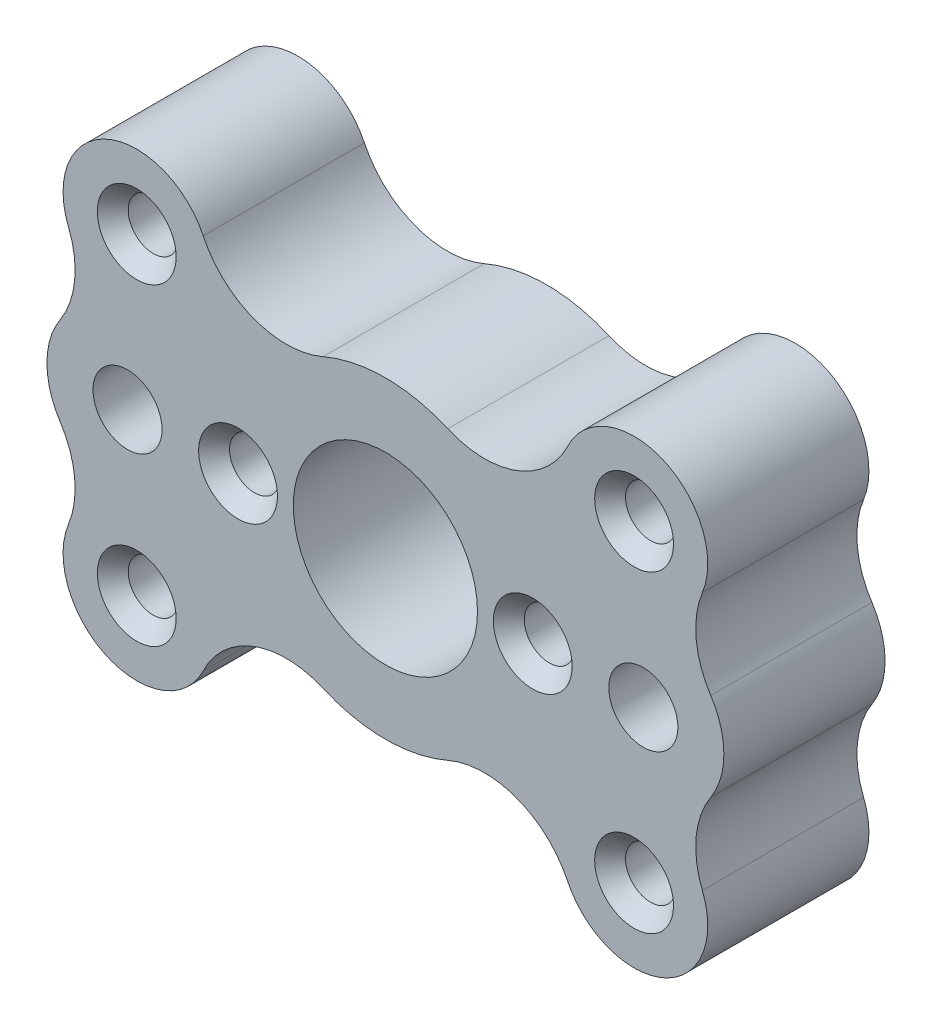
ISO-10303-21;
HEADER;
FILE_DESCRIPTION(('STEP AP214'),'2;1');
FILE_NAME('part.step','',(''),(''),'','','');
FILE_SCHEMA(('AUTOMOTIVE_DESIGN { 1 0 10303 214 1 1 1 1 }'));
ENDSEC;
DATA;
#1=APPLICATION_CONTEXT('core data for automotive mechanical design processes');
#2=APPLICATION_PROTOCOL_DEFINITION('international standard','automotive_design',2000,#1);
#3=PRODUCT_CONTEXT('',#1,'mechanical');
#4=PRODUCT('Part','Part','',(#3));
#5=PRODUCT_RELATED_PRODUCT_CATEGORY('part','',(#4));
#6=PRODUCT_DEFINITION_FORMATION('','',#4);
#7=PRODUCT_DEFINITION_CONTEXT('part definition',#1,'design');
#8=PRODUCT_DEFINITION('design','',#6,#7);
#9=PRODUCT_DEFINITION_SHAPE('','',#8);
#10=(LENGTH_UNIT() NAMED_UNIT(*) SI_UNIT(.MILLI.,.METRE.));
#11=(NAMED_UNIT(*) PLANE_ANGLE_UNIT() SI_UNIT($,.RADIAN.));
#12=(NAMED_UNIT(*) SI_UNIT($,.STERADIAN.) SOLID_ANGLE_UNIT());
#13=UNCERTAINTY_MEASURE_WITH_UNIT(LENGTH_MEASURE(1.E-05),#10,'distance_accuracy_value','');
#14=(GEOMETRIC_REPRESENTATION_CONTEXT(3) GLOBAL_UNCERTAINTY_ASSIGNED_CONTEXT((#13)) GLOBAL_UNIT_ASSIGNED_CONTEXT((#10,
#11,#12)) REPRESENTATION_CONTEXT('',''));
#15=CARTESIAN_POINT('',(0.,0.,0.));
#16=DIRECTION('',(0.,0.,1.));
#17=DIRECTION('',(1.,0.,0.));
#18=AXIS2_PLACEMENT_3D('',#15,#16,#17);
#19=CARTESIAN_POINT('',(0.,0.,11.1125));
#20=DIRECTION('',(0.,0.,1.));
#21=DIRECTION('',(1.,0.,0.));
#22=AXIS2_PLACEMENT_3D('',#19,#20,#21);
#23=PLANE('',#22);
#24=CARTESIAN_POINT('',(6.83271100749172,15.7246648704544,11.1125));
#25=DIRECTION('',(0.,0.,1.));
#26=DIRECTION('',(1.,0.,0.));
#27=AXIS2_PLACEMENT_3D('',#24,#25,#26);
#28=CIRCLE('',#27,6.35);
#29=CARTESIAN_POINT('',(4.3020773010133,9.90071491843423,11.1125));
#30=VERTEX_POINT('',#29);
#31=CARTESIAN_POINT('',(12.5617604477741,12.9859621646464,11.1125));
#32=VERTEX_POINT('',#31);
#33=EDGE_CURVE('E282',#30,#32,#28,.T.);
#34=ORIENTED_EDGE('',*,*,#33,.F.);
#35=CARTESIAN_POINT('',(0.,0.,11.1125));
#36=DIRECTION('',(0.,0.,1.));
#37=DIRECTION('',(1.,0.,0.));
#38=AXIS2_PLACEMENT_3D('',#35,#36,#37);
#39=CIRCLE('',#38,10.795);
#40=CARTESIAN_POINT('',(-4.30207730101329,9.90071491843423,11.1125));
#41=VERTEX_POINT('',#40);
#42=EDGE_CURVE('E109',#30,#41,#39,.T.);
#43=ORIENTED_EDGE('',*,*,#42,.T.);
#44=CARTESIAN_POINT('',(-6.83271100749169,15.7246648704544,11.1125));
#45=DIRECTION('',(0.,0.,-1.));
#46=DIRECTION('',(-1.,0.,0.));
#47=AXIS2_PLACEMENT_3D('',#44,#45,#46);
#48=CIRCLE('',#47,6.35);
#49=CARTESIAN_POINT('',(-12.5617604477741,12.9859621646464,11.1125));
#50=VERTEX_POINT('',#49);
#51=EDGE_CURVE('E208',#41,#50,#48,.T.);
#52=ORIENTED_EDGE('',*,*,#51,.T.);
#53=CARTESIAN_POINT('',(-17.145,10.795,11.1125));
#54=DIRECTION('',(0.,0.,1.));
#55=DIRECTION('',(1.,0.,0.));
#56=AXIS2_PLACEMENT_3D('',#53,#54,#55);
#57=CIRCLE('',#56,5.08);
#58=CARTESIAN_POINT('',(-21.8557818953723,8.89370203959706,11.1125));
#59=VERTEX_POINT('',#58);
#60=EDGE_CURVE('E188',#50,#59,#57,.T.);
#61=ORIENTED_EDGE('',*,*,#60,.T.);
#62=CARTESIAN_POINT('',(-27.7442592645877,6.51707958909339,11.1125));
#63=DIRECTION('',(0.,0.,-1.));
#64=DIRECTION('',(1.,0.,0.));
#65=AXIS2_PLACEMENT_3D('',#62,#63,#64);
#66=CIRCLE('',#65,6.35);
#67=CARTESIAN_POINT('',(-22.4299876568076,3.04130380824358,11.1125));
#68=VERTEX_POINT('',#67);
#69=EDGE_CURVE('E204',#59,#68,#66,.T.);
#70=ORIENTED_EDGE('',*,*,#69,.T.);
#71=CARTESIAN_POINT('',(-17.78,0.,11.1125));
#72=DIRECTION('',(0.,0.,1.));
#73=DIRECTION('',(1.,0.,0.));
#74=AXIS2_PLACEMENT_3D('',#71,#72,#73);
#75=CIRCLE('',#74,5.55625);
#76=CARTESIAN_POINT('',(-22.4299876568076,-3.04130380824359,11.1125));
#77=VERTEX_POINT('',#76);
#78=EDGE_CURVE('E132',#68,#77,#75,.T.);
#79=ORIENTED_EDGE('',*,*,#78,.T.);
#80=CARTESIAN_POINT('',(-27.7442592645877,-6.5170795890934,11.1125));
#81=DIRECTION('',(0.,0.,-1.));
#82=DIRECTION('',(1.,0.,0.));
#83=AXIS2_PLACEMENT_3D('',#80,#81,#82);
#84=CIRCLE('',#83,6.35);
#85=CARTESIAN_POINT('',(-21.8557818953723,-8.89370203959707,11.1125));
#86=VERTEX_POINT('',#85);
#87=EDGE_CURVE('E126',#77,#86,#84,.T.);
#88=ORIENTED_EDGE('',*,*,#87,.T.);
#89=CARTESIAN_POINT('',(-17.145,-10.795,11.1125));
#90=DIRECTION('',(0.,0.,1.));
#91=DIRECTION('',(1.,0.,0.));
#92=AXIS2_PLACEMENT_3D('',#89,#90,#91);
#93=CIRCLE('',#92,5.08);
#94=CARTESIAN_POINT('',(-12.5617604477741,-12.9859621646464,11.1125));
#95=VERTEX_POINT('',#94);
#96=EDGE_CURVE('E130',#86,#95,#93,.T.);
#97=ORIENTED_EDGE('',*,*,#96,.T.);
#98=CARTESIAN_POINT('',(-6.83271100749169,-15.7246648704544,11.1125));
#99=DIRECTION('',(0.,0.,-1.));
#100=DIRECTION('',(-1.,0.,0.));
#101=AXIS2_PLACEMENT_3D('',#98,#99,#100);
#102=CIRCLE('',#101,6.35);
#103=CARTESIAN_POINT('',(-4.30207730101329,-9.90071491843424,11.1125));
#104=VERTEX_POINT('',#103);
#105=EDGE_CURVE('E65',#95,#104,#102,.T.);
#106=ORIENTED_EDGE('',*,*,#105,.T.);
#107=CARTESIAN_POINT('',(0.,0.,11.1125));
#108=DIRECTION('',(0.,0.,1.));
#109=DIRECTION('',(-1.,0.,0.));
#110=AXIS2_PLACEMENT_3D('',#107,#108,#109);
#111=CIRCLE('',#110,10.795);
#112=CARTESIAN_POINT('',(4.30207730101327,-9.90071491843424,11.1125));
#113=VERTEX_POINT('',#112);
#114=EDGE_CURVE('E146',#104,#113,#111,.T.);
#115=ORIENTED_EDGE('',*,*,#114,.T.);
#116=CARTESIAN_POINT('',(6.83271100749166,-15.7246648704544,11.1125));
#117=DIRECTION('',(0.,0.,1.));
#118=DIRECTION('',(1.,0.,0.));
#119=AXIS2_PLACEMENT_3D('',#116,#117,#118);
#120=CIRCLE('',#119,6.35);
#121=CARTESIAN_POINT('',(12.5617604477741,-12.9859621646464,11.1125));
#122=VERTEX_POINT('',#121);
#123=EDGE_CURVE('E278',#122,#113,#120,.T.);
#124=ORIENTED_EDGE('',*,*,#123,.F.);
#125=CARTESIAN_POINT('',(17.145,-10.795,11.1125));
#126=DIRECTION('',(0.,0.,-1.));
#127=DIRECTION('',(-1.,0.,0.));
#128=AXIS2_PLACEMENT_3D('',#125,#126,#127);
#129=CIRCLE('',#128,5.08);
#130=CARTESIAN_POINT('',(21.8557818953723,-8.89370203959711,11.1125));
#131=VERTEX_POINT('',#130);
#132=EDGE_CURVE('E304',#131,#122,#129,.T.);
#133=ORIENTED_EDGE('',*,*,#132,.F.);
#134=CARTESIAN_POINT('',(27.7442592645877,-6.51707958909344,11.1125));
#135=DIRECTION('',(0.,0.,1.));
#136=DIRECTION('',(-1.,0.,0.));
#137=AXIS2_PLACEMENT_3D('',#134,#135,#136);
#138=CIRCLE('',#137,6.35);
#139=CARTESIAN_POINT('',(22.4299876568076,-3.04130380824362,11.1125));
#140=VERTEX_POINT('',#139);
#141=EDGE_CURVE('E307',#140,#131,#138,.T.);
#142=ORIENTED_EDGE('',*,*,#141,.F.);
#143=CARTESIAN_POINT('',(17.78,0.,11.1125));
#144=DIRECTION('',(0.,0.,-1.));
#145=DIRECTION('',(-1.,0.,0.));
#146=AXIS2_PLACEMENT_3D('',#143,#144,#145);
#147=CIRCLE('',#146,5.55625);
#148=CARTESIAN_POINT('',(22.4299876568076,3.04130380824355,11.1125));
#149=VERTEX_POINT('',#148);
#150=EDGE_CURVE('E310',#149,#140,#147,.T.);
#151=ORIENTED_EDGE('',*,*,#150,.F.);
#152=CARTESIAN_POINT('',(27.7442592645877,6.51707958909334,11.1125));
#153=DIRECTION('',(0.,0.,1.));
#154=DIRECTION('',(-1.,0.,0.));
#155=AXIS2_PLACEMENT_3D('',#152,#153,#154);
#156=CIRCLE('',#155,6.35);
#157=CARTESIAN_POINT('',(21.8557818953723,8.89370203959702,11.1125));
#158=VERTEX_POINT('',#157);
#159=EDGE_CURVE('E313',#158,#149,#156,.T.);
#160=ORIENTED_EDGE('',*,*,#159,.F.);
#161=CARTESIAN_POINT('',(17.145,10.795,11.1125));
#162=DIRECTION('',(0.,0.,-1.));
#163=DIRECTION('',(-1.,0.,0.));
#164=AXIS2_PLACEMENT_3D('',#161,#162,#163);
#165=CIRCLE('',#164,5.08);
#166=EDGE_CURVE('E316',#32,#158,#165,.T.);
#167=ORIENTED_EDGE('',*,*,#166,.F.);
#168=EDGE_LOOP('',(#34,#43,#52,#61,#70,#79,#88,#97,#106,#115,#124,#133,#142,#151,#160,#167));
#169=FACE_BOUND('',#168,.T.);
#170=CARTESIAN_POINT('',(-10.16,0.,11.1125));
#171=DIRECTION('',(0.,0.,1.));
#172=DIRECTION('',(1.,0.,0.));
#173=AXIS2_PLACEMENT_3D('',#170,#171,#172);
#174=CIRCLE('',#173,2.7178);
#175=CARTESIAN_POINT('',(-7.4422,0.,11.1125));
#176=VERTEX_POINT('',#175);
#177=EDGE_CURVE('E248',#176,#176,#174,.T.);
#178=ORIENTED_EDGE('',*,*,#177,.F.);
#179=EDGE_LOOP('',(#178));
#180=FACE_BOUND('',#179,.T.);
#181=CARTESIAN_POINT('',(-17.145,10.795,11.1125));
#182=DIRECTION('',(0.,0.,1.));
#183=DIRECTION('',(1.,0.,0.));
#184=AXIS2_PLACEMENT_3D('',#181,#182,#183);
#185=CIRCLE('',#184,2.7178);
#186=CARTESIAN_POINT('',(-14.4272,10.795,11.1125));
#187=VERTEX_POINT('',#186);
#188=EDGE_CURVE('E236',#187,#187,#185,.T.);
#189=ORIENTED_EDGE('',*,*,#188,.F.);
#190=EDGE_LOOP('',(#189));
#191=FACE_BOUND('',#190,.T.);
#192=CARTESIAN_POINT('',(-17.145,-10.795,11.1125));
#193=DIRECTION('',(0.,0.,1.));
#194=DIRECTION('',(1.,0.,0.));
#195=AXIS2_PLACEMENT_3D('',#192,#193,#194);
#196=CIRCLE('',#195,2.7178);
#197=CARTESIAN_POINT('',(-14.4272,-10.795,11.1125));
#198=VERTEX_POINT('',#197);
#199=EDGE_CURVE('E224',#198,#198,#196,.T.);
#200=ORIENTED_EDGE('',*,*,#199,.F.);
#201=EDGE_LOOP('',(#200));
#202=FACE_BOUND('',#201,.T.);
#203=CARTESIAN_POINT('',(0.,0.,11.1125));
#204=DIRECTION('',(0.,0.,-1.));
#205=DIRECTION('',(1.,0.,0.));
#206=AXIS2_PLACEMENT_3D('',#203,#204,#205);
#207=CIRCLE('',#206,6.35);
#208=CARTESIAN_POINT('',(6.35,0.,11.1125));
#209=VERTEX_POINT('',#208);
#210=EDGE_CURVE('E172',#209,#209,#207,.T.);
#211=ORIENTED_EDGE('',*,*,#210,.T.);
#212=EDGE_LOOP('',(#211));
#213=FACE_BOUND('',#212,.T.);
#214=CARTESIAN_POINT('',(-17.78,0.,11.1125));
#215=DIRECTION('',(0.,0.,1.));
#216=DIRECTION('',(1.,0.,0.));
#217=AXIS2_PLACEMENT_3D('',#214,#215,#216);
#218=CIRCLE('',#217,2.38125);
#219=CARTESIAN_POINT('',(-15.39875,0.,11.1125));
#220=VERTEX_POINT('',#219);
#221=EDGE_CURVE('E156',#220,#220,#218,.T.);
#222=ORIENTED_EDGE('',*,*,#221,.F.);
#223=EDGE_LOOP('',(#222));
#224=FACE_BOUND('',#223,.T.);
#225=CARTESIAN_POINT('',(10.16,0.,11.1125));
#226=DIRECTION('',(0.,0.,-1.));
#227=DIRECTION('',(-1.,0.,0.));
#228=AXIS2_PLACEMENT_3D('',#225,#226,#227);
#229=CIRCLE('',#228,2.7178);
#230=CARTESIAN_POINT('',(7.4422,0.,11.1125));
#231=VERTEX_POINT('',#230);
#232=EDGE_CURVE('E356',#231,#231,#229,.T.);
#233=ORIENTED_EDGE('',*,*,#232,.T.);
#234=EDGE_LOOP('',(#233));
#235=FACE_BOUND('',#234,.T.);
#236=CARTESIAN_POINT('',(17.145,10.795,11.1125));
#237=DIRECTION('',(0.,0.,-1.));
#238=DIRECTION('',(-1.,0.,0.));
#239=AXIS2_PLACEMENT_3D('',#236,#237,#238);
#240=CIRCLE('',#239,2.7178);
#241=CARTESIAN_POINT('',(14.4272,10.795,11.1125));
#242=VERTEX_POINT('',#241);
#243=EDGE_CURVE('E344',#242,#242,#240,.T.);
#244=ORIENTED_EDGE('',*,*,#243,.T.);
#245=EDGE_LOOP('',(#244));
#246=FACE_BOUND('',#245,.T.);
#247=CARTESIAN_POINT('',(17.145,-10.795,11.1125));
#248=DIRECTION('',(0.,0.,-1.));
#249=DIRECTION('',(-1.,0.,0.));
#250=AXIS2_PLACEMENT_3D('',#247,#248,#249);
#251=CIRCLE('',#250,2.7178);
#252=CARTESIAN_POINT('',(14.4272,-10.795,11.1125));
#253=VERTEX_POINT('',#252);
#254=EDGE_CURVE('E332',#253,#253,#251,.T.);
#255=ORIENTED_EDGE('',*,*,#254,.T.);
#256=EDGE_LOOP('',(#255));
#257=FACE_BOUND('',#256,.T.);
#258=CARTESIAN_POINT('',(17.78,0.,11.1125));
#259=DIRECTION('',(0.,0.,-1.));
#260=DIRECTION('',(-1.,0.,0.));
#261=AXIS2_PLACEMENT_3D('',#258,#259,#260);
#262=CIRCLE('',#261,2.38125);
#263=CARTESIAN_POINT('',(15.39875,0.,11.1125));
#264=VERTEX_POINT('',#263);
#265=EDGE_CURVE('E301',#264,#264,#262,.T.);
#266=ORIENTED_EDGE('',*,*,#265,.T.);
#267=EDGE_LOOP('',(#266));
#268=FACE_BOUND('',#267,.T.);
#269=ADVANCED_FACE('F48',(#169,#180,#191,#202,#213,#224,#235,#246,#257,#268),#23,.T.);
#270=CARTESIAN_POINT('',(0.,0.,0.));
#271=DIRECTION('',(0.,0.,1.));
#272=DIRECTION('',(1.,0.,0.));
#273=AXIS2_PLACEMENT_3D('',#270,#271,#272);
#274=PLANE('',#273);
#275=CARTESIAN_POINT('',(0.,0.,0.));
#276=DIRECTION('',(0.,0.,1.));
#277=DIRECTION('',(1.,0.,0.));
#278=AXIS2_PLACEMENT_3D('',#275,#276,#277);
#279=CIRCLE('',#278,10.795);
#280=CARTESIAN_POINT('',(4.3020773010133,9.90071491843423,0.));
#281=VERTEX_POINT('',#280);
#282=CARTESIAN_POINT('',(-4.30207730101329,9.90071491843423,0.));
#283=VERTEX_POINT('',#282);
#284=EDGE_CURVE('E155',#281,#283,#279,.T.);
#285=ORIENTED_EDGE('',*,*,#284,.F.);
#286=CARTESIAN_POINT('',(6.83271100749172,15.7246648704544,0.));
#287=DIRECTION('',(0.,0.,1.));
#288=DIRECTION('',(1.,0.,0.));
#289=AXIS2_PLACEMENT_3D('',#286,#287,#288);
#290=CIRCLE('',#289,6.35);
#291=CARTESIAN_POINT('',(12.5617604477741,12.9859621646464,0.));
#292=VERTEX_POINT('',#291);
#293=EDGE_CURVE('E298',#281,#292,#290,.T.);
#294=ORIENTED_EDGE('',*,*,#293,.T.);
#295=CARTESIAN_POINT('',(17.145,10.795,0.));
#296=DIRECTION('',(0.,0.,-1.));
#297=DIRECTION('',(-1.,0.,0.));
#298=AXIS2_PLACEMENT_3D('',#295,#296,#297);
#299=CIRCLE('',#298,5.08);
#300=CARTESIAN_POINT('',(21.8557818953723,8.89370203959702,0.));
#301=VERTEX_POINT('',#300);
#302=EDGE_CURVE('E295',#292,#301,#299,.T.);
#303=ORIENTED_EDGE('',*,*,#302,.T.);
#304=CARTESIAN_POINT('',(27.7442592645877,6.51707958909334,0.));
#305=DIRECTION('',(0.,0.,1.));
#306=DIRECTION('',(-1.,0.,0.));
#307=AXIS2_PLACEMENT_3D('',#304,#305,#306);
#308=CIRCLE('',#307,6.35);
#309=CARTESIAN_POINT('',(22.4299876568076,3.04130380824355,0.));
#310=VERTEX_POINT('',#309);
#311=EDGE_CURVE('E292',#301,#310,#308,.T.);
#312=ORIENTED_EDGE('',*,*,#311,.T.);
#313=CARTESIAN_POINT('',(17.78,0.,0.));
#314=DIRECTION('',(0.,0.,-1.));
#315=DIRECTION('',(-1.,0.,0.));
#316=AXIS2_PLACEMENT_3D('',#313,#314,#315);
#317=CIRCLE('',#316,5.55625);
#318=CARTESIAN_POINT('',(22.4299876568076,-3.04130380824362,0.));
#319=VERTEX_POINT('',#318);
#320=EDGE_CURVE('E289',#310,#319,#317,.T.);
#321=ORIENTED_EDGE('',*,*,#320,.T.);
#322=CARTESIAN_POINT('',(27.7442592645877,-6.51707958909344,0.));
#323=DIRECTION('',(0.,0.,1.));
#324=DIRECTION('',(-1.,0.,0.));
#325=AXIS2_PLACEMENT_3D('',#322,#323,#324);
#326=CIRCLE('',#325,6.35);
#327=CARTESIAN_POINT('',(21.8557818953723,-8.89370203959711,0.));
#328=VERTEX_POINT('',#327);
#329=EDGE_CURVE('E286',#319,#328,#326,.T.);
#330=ORIENTED_EDGE('',*,*,#329,.T.);
#331=CARTESIAN_POINT('',(17.145,-10.795,0.));
#332=DIRECTION('',(0.,0.,-1.));
#333=DIRECTION('',(-1.,0.,0.));
#334=AXIS2_PLACEMENT_3D('',#331,#332,#333);
#335=CIRCLE('',#334,5.08);
#336=CARTESIAN_POINT('',(12.5617604477741,-12.9859621646464,0.));
#337=VERTEX_POINT('',#336);
#338=EDGE_CURVE('E283',#328,#337,#335,.T.);
#339=ORIENTED_EDGE('',*,*,#338,.T.);
#340=CARTESIAN_POINT('',(6.83271100749166,-15.7246648704544,0.));
#341=DIRECTION('',(0.,0.,1.));
#342=DIRECTION('',(1.,0.,0.));
#343=AXIS2_PLACEMENT_3D('',#340,#341,#342);
#344=CIRCLE('',#343,6.35);
#345=CARTESIAN_POINT('',(4.30207730101327,-9.90071491843424,0.));
#346=VERTEX_POINT('',#345);
#347=EDGE_CURVE('E279',#337,#346,#344,.T.);
#348=ORIENTED_EDGE('',*,*,#347,.T.);
#349=CARTESIAN_POINT('',(0.,0.,0.));
#350=DIRECTION('',(0.,0.,1.));
#351=DIRECTION('',(-1.,0.,0.));
#352=AXIS2_PLACEMENT_3D('',#349,#350,#351);
#353=CIRCLE('',#352,10.795);
#354=CARTESIAN_POINT('',(-4.30207730101329,-9.90071491843424,0.));
#355=VERTEX_POINT('',#354);
#356=EDGE_CURVE('E169',#355,#346,#353,.T.);
#357=ORIENTED_EDGE('',*,*,#356,.F.);
#358=CARTESIAN_POINT('',(-6.83271100749169,-15.7246648704544,0.));
#359=DIRECTION('',(0.,0.,-1.));
#360=DIRECTION('',(-1.,0.,0.));
#361=AXIS2_PLACEMENT_3D('',#358,#359,#360);
#362=CIRCLE('',#361,6.35);
#363=CARTESIAN_POINT('',(-12.5617604477741,-12.9859621646464,0.));
#364=VERTEX_POINT('',#363);
#365=EDGE_CURVE('E101',#364,#355,#362,.T.);
#366=ORIENTED_EDGE('',*,*,#365,.F.);
#367=CARTESIAN_POINT('',(-17.145,-10.795,0.));
#368=DIRECTION('',(0.,0.,1.));
#369=DIRECTION('',(1.,0.,0.));
#370=AXIS2_PLACEMENT_3D('',#367,#368,#369);
#371=CIRCLE('',#370,5.08);
#372=CARTESIAN_POINT('',(-21.8557818953723,-8.89370203959707,0.));
#373=VERTEX_POINT('',#372);
#374=EDGE_CURVE('E95',#373,#364,#371,.T.);
#375=ORIENTED_EDGE('',*,*,#374,.F.);
#376=CARTESIAN_POINT('',(-27.7442592645877,-6.5170795890934,0.));
#377=DIRECTION('',(0.,0.,-1.));
#378=DIRECTION('',(1.,0.,0.));
#379=AXIS2_PLACEMENT_3D('',#376,#377,#378);
#380=CIRCLE('',#379,6.35);
#381=CARTESIAN_POINT('',(-22.4299876568076,-3.04130380824359,0.));
#382=VERTEX_POINT('',#381);
#383=EDGE_CURVE('E140',#382,#373,#380,.T.);
#384=ORIENTED_EDGE('',*,*,#383,.F.);
#385=CARTESIAN_POINT('',(-17.78,0.,0.));
#386=DIRECTION('',(0.,0.,1.));
#387=DIRECTION('',(1.,0.,0.));
#388=AXIS2_PLACEMENT_3D('',#385,#386,#387);
#389=CIRCLE('',#388,5.55625);
#390=CARTESIAN_POINT('',(-22.4299876568076,3.04130380824358,0.));
#391=VERTEX_POINT('',#390);
#392=EDGE_CURVE('E164',#391,#382,#389,.T.);
#393=ORIENTED_EDGE('',*,*,#392,.F.);
#394=CARTESIAN_POINT('',(-27.7442592645877,6.51707958909339,0.));
#395=DIRECTION('',(0.,0.,-1.));
#396=DIRECTION('',(1.,0.,0.));
#397=AXIS2_PLACEMENT_3D('',#394,#395,#396);
#398=CIRCLE('',#397,6.35);
#399=CARTESIAN_POINT('',(-21.8557818953723,8.89370203959706,0.));
#400=VERTEX_POINT('',#399);
#401=EDGE_CURVE('E162',#400,#391,#398,.T.);
#402=ORIENTED_EDGE('',*,*,#401,.F.);
#403=CARTESIAN_POINT('',(-17.145,10.795,0.));
#404=DIRECTION('',(0.,0.,1.));
#405=DIRECTION('',(1.,0.,0.));
#406=AXIS2_PLACEMENT_3D('',#403,#404,#405);
#407=CIRCLE('',#406,5.08);
#408=CARTESIAN_POINT('',(-12.5617604477741,12.9859621646464,0.));
#409=VERTEX_POINT('',#408);
#410=EDGE_CURVE('E160',#409,#400,#407,.T.);
#411=ORIENTED_EDGE('',*,*,#410,.F.);
#412=CARTESIAN_POINT('',(-6.83271100749169,15.7246648704544,0.));
#413=DIRECTION('',(0.,0.,-1.));
#414=DIRECTION('',(-1.,0.,0.));
#415=AXIS2_PLACEMENT_3D('',#412,#413,#414);
#416=CIRCLE('',#415,6.35);
#417=EDGE_CURVE('E158',#283,#409,#416,.T.);
#418=ORIENTED_EDGE('',*,*,#417,.F.);
#419=EDGE_LOOP('',(#285,#294,#303,#312,#321,#330,#339,#348,#357,#366,#375,#384,#393,#402,#411,#418));
#420=FACE_BOUND('',#419,.T.);
#421=CARTESIAN_POINT('',(-10.16,0.,0.));
#422=DIRECTION('',(0.,0.,1.));
#423=DIRECTION('',(1.,0.,0.));
#424=AXIS2_PLACEMENT_3D('',#421,#422,#423);
#425=CIRCLE('',#424,2.72923);
#426=CARTESIAN_POINT('',(-7.43077,0.,0.));
#427=VERTEX_POINT('',#426);
#428=EDGE_CURVE('E251',#427,#427,#425,.T.);
#429=ORIENTED_EDGE('',*,*,#428,.T.);
#430=EDGE_LOOP('',(#429));
#431=FACE_BOUND('',#430,.T.);
#432=CARTESIAN_POINT('',(-17.145,10.795,0.));
#433=DIRECTION('',(0.,0.,1.));
#434=DIRECTION('',(1.,0.,0.));
#435=AXIS2_PLACEMENT_3D('',#432,#433,#434);
#436=CIRCLE('',#435,2.72923);
#437=CARTESIAN_POINT('',(-14.41577,10.795,0.));
#438=VERTEX_POINT('',#437);
#439=EDGE_CURVE('E239',#438,#438,#436,.T.);
#440=ORIENTED_EDGE('',*,*,#439,.T.);
#441=EDGE_LOOP('',(#440));
#442=FACE_BOUND('',#441,.T.);
#443=CARTESIAN_POINT('',(-17.145,-10.795,0.));
#444=DIRECTION('',(0.,0.,1.));
#445=DIRECTION('',(1.,0.,0.));
#446=AXIS2_PLACEMENT_3D('',#443,#444,#445);
#447=CIRCLE('',#446,2.72923);
#448=CARTESIAN_POINT('',(-14.41577,-10.795,0.));
#449=VERTEX_POINT('',#448);
#450=EDGE_CURVE('E227',#449,#449,#447,.T.);
#451=ORIENTED_EDGE('',*,*,#450,.T.);
#452=EDGE_LOOP('',(#451));
#453=FACE_BOUND('',#452,.T.);
#454=CARTESIAN_POINT('',(0.,0.,0.));
#455=DIRECTION('',(0.,0.,-1.));
#456=DIRECTION('',(1.,0.,0.));
#457=AXIS2_PLACEMENT_3D('',#454,#455,#456);
#458=CIRCLE('',#457,6.35);
#459=CARTESIAN_POINT('',(6.35,0.,0.));
#460=VERTEX_POINT('',#459);
#461=EDGE_CURVE('E152',#460,#460,#458,.T.);
#462=ORIENTED_EDGE('',*,*,#461,.F.);
#463=EDGE_LOOP('',(#462));
#464=FACE_BOUND('',#463,.T.);
#465=CARTESIAN_POINT('',(-17.78,0.,0.));
#466=DIRECTION('',(0.,0.,1.));
#467=DIRECTION('',(1.,0.,0.));
#468=AXIS2_PLACEMENT_3D('',#465,#466,#467);
#469=CIRCLE('',#468,2.38125);
#470=CARTESIAN_POINT('',(-15.39875,0.,0.));
#471=VERTEX_POINT('',#470);
#472=EDGE_CURVE('E213',#471,#471,#469,.T.);
#473=ORIENTED_EDGE('',*,*,#472,.T.);
#474=EDGE_LOOP('',(#473));
#475=FACE_BOUND('',#474,.T.);
#476=CARTESIAN_POINT('',(10.16,0.,0.));
#477=DIRECTION('',(0.,0.,-1.));
#478=DIRECTION('',(-1.,0.,0.));
#479=AXIS2_PLACEMENT_3D('',#476,#477,#478);
#480=CIRCLE('',#479,2.72923);
#481=CARTESIAN_POINT('',(7.43077,0.,0.));
#482=VERTEX_POINT('',#481);
#483=EDGE_CURVE('E359',#482,#482,#480,.T.);
#484=ORIENTED_EDGE('',*,*,#483,.F.);
#485=EDGE_LOOP('',(#484));
#486=FACE_BOUND('',#485,.T.);
#487=CARTESIAN_POINT('',(17.145,10.795,0.));
#488=DIRECTION('',(0.,0.,-1.));
#489=DIRECTION('',(-1.,0.,0.));
#490=AXIS2_PLACEMENT_3D('',#487,#488,#489);
#491=CIRCLE('',#490,2.72923);
#492=CARTESIAN_POINT('',(14.41577,10.795,0.));
#493=VERTEX_POINT('',#492);
#494=EDGE_CURVE('E347',#493,#493,#491,.T.);
#495=ORIENTED_EDGE('',*,*,#494,.F.);
#496=EDGE_LOOP('',(#495));
#497=FACE_BOUND('',#496,.T.);
#498=CARTESIAN_POINT('',(17.145,-10.795,0.));
#499=DIRECTION('',(0.,0.,-1.));
#500=DIRECTION('',(-1.,0.,0.));
#501=AXIS2_PLACEMENT_3D('',#498,#499,#500);
#502=CIRCLE('',#501,2.72923);
#503=CARTESIAN_POINT('',(14.41577,-10.795,0.));
#504=VERTEX_POINT('',#503);
#505=EDGE_CURVE('E335',#504,#504,#502,.T.);
#506=ORIENTED_EDGE('',*,*,#505,.F.);
#507=EDGE_LOOP('',(#506));
#508=FACE_BOUND('',#507,.T.);
#509=CARTESIAN_POINT('',(17.78,0.,0.));
#510=DIRECTION('',(0.,0.,-1.));
#511=DIRECTION('',(-1.,0.,0.));
#512=AXIS2_PLACEMENT_3D('',#509,#510,#511);
#513=CIRCLE('',#512,2.38125);
#514=CARTESIAN_POINT('',(15.39875,0.,0.));
#515=VERTEX_POINT('',#514);
#516=EDGE_CURVE('E321',#515,#515,#513,.T.);
#517=ORIENTED_EDGE('',*,*,#516,.F.);
#518=EDGE_LOOP('',(#517));
#519=FACE_BOUND('',#518,.T.);
#520=ADVANCED_FACE('F195',(#420,#431,#442,#453,#464,#475,#486,#497,#508,#519),#274,.F.);
#521=CARTESIAN_POINT('',(0.,0.,11.1125));
#522=DIRECTION('',(0.,0.,-1.));
#523=DIRECTION('',(-1.,0.,0.));
#524=AXIS2_PLACEMENT_3D('',#521,#522,#523);
#525=CYLINDRICAL_SURFACE('',#524,6.35);
#526=ORIENTED_EDGE('',*,*,#461,.T.);
#527=EDGE_LOOP('',(#526));
#528=FACE_BOUND('',#527,.T.);
#529=ORIENTED_EDGE('',*,*,#210,.F.);
#530=EDGE_LOOP('',(#529));
#531=FACE_BOUND('',#530,.T.);
#532=ADVANCED_FACE('F50',(#528,#531),#525,.F.);
#533=CARTESIAN_POINT('',(0.,0.,11.1125));
#534=DIRECTION('',(0.,0.,-1.));
#535=DIRECTION('',(-1.,0.,0.));
#536=AXIS2_PLACEMENT_3D('',#533,#534,#535);
#537=CYLINDRICAL_SURFACE('',#536,10.795);
#538=ORIENTED_EDGE('',*,*,#284,.T.);
#539=DIRECTION('',(0.,0.,-1.));
#540=VECTOR('',#539,1.);
#541=CARTESIAN_POINT('',(-4.30207730101329,9.90071491843423,11.1125));
#542=LINE('',#541,#540);
#543=EDGE_CURVE('E13',#41,#283,#542,.T.);
#544=ORIENTED_EDGE('',*,*,#543,.F.);
#545=ORIENTED_EDGE('',*,*,#42,.F.);
#546=DIRECTION('',(0.,0.,-1.));
#547=VECTOR('',#546,1.);
#548=CARTESIAN_POINT('',(4.3020773010133,9.90071491843423,11.1125));
#549=LINE('',#548,#547);
#550=EDGE_CURVE('E254',#30,#281,#549,.T.);
#551=ORIENTED_EDGE('',*,*,#550,.T.);
#552=EDGE_LOOP('',(#538,#544,#545,#551));
#553=FACE_BOUND('',#552,.T.);
#554=ADVANCED_FACE('F419',(#553),#537,.T.);
#555=CARTESIAN_POINT('',(-6.83271100749169,15.7246648704544,11.1125));
#556=DIRECTION('',(0.,0.,-1.));
#557=DIRECTION('',(-1.,0.,0.));
#558=AXIS2_PLACEMENT_3D('',#555,#556,#557);
#559=CYLINDRICAL_SURFACE('',#558,6.35);
#560=ORIENTED_EDGE('',*,*,#417,.T.);
#561=DIRECTION('',(0.,0.,-1.));
#562=VECTOR('',#561,1.);
#563=CARTESIAN_POINT('',(-12.5617604477741,12.9859621646464,11.1125));
#564=LINE('',#563,#562);
#565=EDGE_CURVE('E57',#50,#409,#564,.T.);
#566=ORIENTED_EDGE('',*,*,#565,.F.);
#567=ORIENTED_EDGE('',*,*,#51,.F.);
#568=ORIENTED_EDGE('',*,*,#543,.T.);
#569=EDGE_LOOP('',(#560,#566,#567,#568));
#570=FACE_BOUND('',#569,.T.);
#571=ADVANCED_FACE('F417',(#570),#559,.F.);
#572=CARTESIAN_POINT('',(-17.145,10.795,11.1125));
#573=DIRECTION('',(0.,0.,-1.));
#574=DIRECTION('',(-1.,0.,0.));
#575=AXIS2_PLACEMENT_3D('',#572,#573,#574);
#576=CYLINDRICAL_SURFACE('',#575,5.08);
#577=ORIENTED_EDGE('',*,*,#410,.T.);
#578=DIRECTION('',(0.,0.,-1.));
#579=VECTOR('',#578,1.);
#580=CARTESIAN_POINT('',(-21.8557818953723,8.89370203959706,11.1125));
#581=LINE('',#580,#579);
#582=EDGE_CURVE('E179',#59,#400,#581,.T.);
#583=ORIENTED_EDGE('',*,*,#582,.F.);
#584=ORIENTED_EDGE('',*,*,#60,.F.);
#585=ORIENTED_EDGE('',*,*,#565,.T.);
#586=EDGE_LOOP('',(#577,#583,#584,#585));
#587=FACE_BOUND('',#586,.T.);
#588=ADVANCED_FACE('F186',(#587),#576,.T.);
#589=CARTESIAN_POINT('',(-27.7442592645877,6.51707958909339,11.1125));
#590=DIRECTION('',(0.,0.,-1.));
#591=DIRECTION('',(-1.,0.,0.));
#592=AXIS2_PLACEMENT_3D('',#589,#590,#591);
#593=CYLINDRICAL_SURFACE('',#592,6.35);
#594=ORIENTED_EDGE('',*,*,#401,.T.);
#595=DIRECTION('',(0.,0.,-1.));
#596=VECTOR('',#595,1.);
#597=CARTESIAN_POINT('',(-22.4299876568076,3.04130380824358,11.1125));
#598=LINE('',#597,#596);
#599=EDGE_CURVE('E176',#68,#391,#598,.T.);
#600=ORIENTED_EDGE('',*,*,#599,.F.);
#601=ORIENTED_EDGE('',*,*,#69,.F.);
#602=ORIENTED_EDGE('',*,*,#582,.T.);
#603=EDGE_LOOP('',(#594,#600,#601,#602));
#604=FACE_BOUND('',#603,.T.);
#605=ADVANCED_FACE('F200',(#604),#593,.F.);
#606=CARTESIAN_POINT('',(-17.78,0.,11.1125));
#607=DIRECTION('',(0.,0.,-1.));
#608=DIRECTION('',(-1.,0.,0.));
#609=AXIS2_PLACEMENT_3D('',#606,#607,#608);
#610=CYLINDRICAL_SURFACE('',#609,5.55625);
#611=ORIENTED_EDGE('',*,*,#392,.T.);
#612=DIRECTION('',(0.,0.,-1.));
#613=VECTOR('',#612,1.);
#614=CARTESIAN_POINT('',(-22.4299876568076,-3.04130380824359,11.1125));
#615=LINE('',#614,#613);
#616=EDGE_CURVE('E141',#77,#382,#615,.T.);
#617=ORIENTED_EDGE('',*,*,#616,.F.);
#618=ORIENTED_EDGE('',*,*,#78,.F.);
#619=ORIENTED_EDGE('',*,*,#599,.T.);
#620=EDGE_LOOP('',(#611,#617,#618,#619));
#621=FACE_BOUND('',#620,.T.);
#622=ADVANCED_FACE('F203',(#621),#610,.T.);
#623=CARTESIAN_POINT('',(-27.7442592645877,-6.5170795890934,11.1125));
#624=DIRECTION('',(0.,0.,-1.));
#625=DIRECTION('',(-1.,0.,0.));
#626=AXIS2_PLACEMENT_3D('',#623,#624,#625);
#627=CYLINDRICAL_SURFACE('',#626,6.35);
#628=ORIENTED_EDGE('',*,*,#383,.T.);
#629=DIRECTION('',(0.,0.,-1.));
#630=VECTOR('',#629,1.);
#631=CARTESIAN_POINT('',(-21.8557818953723,-8.89370203959707,11.1125));
#632=LINE('',#631,#630);
#633=EDGE_CURVE('E137',#86,#373,#632,.T.);
#634=ORIENTED_EDGE('',*,*,#633,.F.);
#635=ORIENTED_EDGE('',*,*,#87,.F.);
#636=ORIENTED_EDGE('',*,*,#616,.T.);
#637=EDGE_LOOP('',(#628,#634,#635,#636));
#638=FACE_BOUND('',#637,.T.);
#639=ADVANCED_FACE('F138',(#638),#627,.F.);
#640=CARTESIAN_POINT('',(-17.145,-10.795,11.1125));
#641=DIRECTION('',(0.,0.,-1.));
#642=DIRECTION('',(-1.,0.,0.));
#643=AXIS2_PLACEMENT_3D('',#640,#641,#642);
#644=CYLINDRICAL_SURFACE('',#643,5.08);
#645=ORIENTED_EDGE('',*,*,#374,.T.);
#646=DIRECTION('',(0.,0.,-1.));
#647=VECTOR('',#646,1.);
#648=CARTESIAN_POINT('',(-12.5617604477741,-12.9859621646464,11.1125));
#649=LINE('',#648,#647);
#650=EDGE_CURVE('E142',#95,#364,#649,.T.);
#651=ORIENTED_EDGE('',*,*,#650,.F.);
#652=ORIENTED_EDGE('',*,*,#96,.F.);
#653=ORIENTED_EDGE('',*,*,#633,.T.);
#654=EDGE_LOOP('',(#645,#651,#652,#653));
#655=FACE_BOUND('',#654,.T.);
#656=ADVANCED_FACE('F144',(#655),#644,.T.);
#657=CARTESIAN_POINT('',(-6.83271100749169,-15.7246648704544,11.1125));
#658=DIRECTION('',(0.,0.,-1.));
#659=DIRECTION('',(-1.,0.,0.));
#660=AXIS2_PLACEMENT_3D('',#657,#658,#659);
#661=CYLINDRICAL_SURFACE('',#660,6.35);
#662=ORIENTED_EDGE('',*,*,#365,.T.);
#663=DIRECTION('',(0.,0.,-1.));
#664=VECTOR('',#663,1.);
#665=CARTESIAN_POINT('',(-4.30207730101329,-9.90071491843424,11.1125));
#666=LINE('',#665,#664);
#667=EDGE_CURVE('E151',#104,#355,#666,.T.);
#668=ORIENTED_EDGE('',*,*,#667,.F.);
#669=ORIENTED_EDGE('',*,*,#105,.F.);
#670=ORIENTED_EDGE('',*,*,#650,.T.);
#671=EDGE_LOOP('',(#662,#668,#669,#670));
#672=FACE_BOUND('',#671,.T.);
#673=ADVANCED_FACE('F403',(#672),#661,.F.);
#674=CARTESIAN_POINT('',(0.,0.,11.1125));
#675=DIRECTION('',(0.,0.,-1.));
#676=DIRECTION('',(-1.,0.,0.));
#677=AXIS2_PLACEMENT_3D('',#674,#675,#676);
#678=CYLINDRICAL_SURFACE('',#677,10.795);
#679=ORIENTED_EDGE('',*,*,#356,.T.);
#680=DIRECTION('',(0.,0.,-1.));
#681=VECTOR('',#680,1.);
#682=CARTESIAN_POINT('',(4.30207730101327,-9.90071491843424,11.1125));
#683=LINE('',#682,#681);
#684=EDGE_CURVE('E275',#113,#346,#683,.T.);
#685=ORIENTED_EDGE('',*,*,#684,.F.);
#686=ORIENTED_EDGE('',*,*,#114,.F.);
#687=ORIENTED_EDGE('',*,*,#667,.T.);
#688=EDGE_LOOP('',(#679,#685,#686,#687));
#689=FACE_BOUND('',#688,.T.);
#690=ADVANCED_FACE('F400',(#689),#678,.T.);
#691=CARTESIAN_POINT('',(-17.78,0.,11.1125));
#692=DIRECTION('',(0.,0.,-1.));
#693=DIRECTION('',(-1.,0.,0.));
#694=AXIS2_PLACEMENT_3D('',#691,#692,#693);
#695=CYLINDRICAL_SURFACE('',#694,2.38125);
#696=ORIENTED_EDGE('',*,*,#221,.T.);
#697=EDGE_LOOP('',(#696));
#698=FACE_BOUND('',#697,.T.);
#699=ORIENTED_EDGE('',*,*,#472,.F.);
#700=EDGE_LOOP('',(#699));
#701=FACE_BOUND('',#700,.T.);
#702=ADVANCED_FACE('F397',(#698,#701),#695,.F.);
#703=CARTESIAN_POINT('',(-17.145,-10.795,1.15270365508767));
#704=DIRECTION('',(0.,0.,-1.));
#705=DIRECTION('',(-1.,0.,0.));
#706=AXIS2_PLACEMENT_3D('',#703,#704,#705);
#707=CONICAL_SURFACE('',#706,1.7272,0.715584993317673);
#708=ORIENTED_EDGE('',*,*,#450,.F.);
#709=EDGE_LOOP('',(#708));
#710=FACE_BOUND('',#709,.T.);
#711=CARTESIAN_POINT('',(-17.145,-10.795,1.15270365508767));
#712=DIRECTION('',(0.,0.,1.));
#713=DIRECTION('',(1.,0.,0.));
#714=AXIS2_PLACEMENT_3D('',#711,#712,#713);
#715=CIRCLE('',#714,1.7272);
#716=CARTESIAN_POINT('',(-15.4178,-10.795,1.15270365508767));
#717=VERTEX_POINT('',#716);
#718=EDGE_CURVE('E216',#717,#717,#715,.T.);
#719=ORIENTED_EDGE('',*,*,#718,.T.);
#720=EDGE_LOOP('',(#719));
#721=FACE_BOUND('',#720,.T.);
#722=ADVANCED_FACE('F526',(#710,#721),#707,.F.);
#723=CARTESIAN_POINT('',(-17.145,-10.795,11.1125));
#724=DIRECTION('',(0.,0.,1.));
#725=DIRECTION('',(1.,0.,0.));
#726=AXIS2_PLACEMENT_3D('',#723,#724,#725);
#727=CYLINDRICAL_SURFACE('',#726,1.7272);
#728=ORIENTED_EDGE('',*,*,#718,.F.);
#729=EDGE_LOOP('',(#728));
#730=FACE_BOUND('',#729,.T.);
#731=CARTESIAN_POINT('',(-17.145,-10.795,9.97294505580687));
#732=DIRECTION('',(0.,0.,1.));
#733=DIRECTION('',(1.,0.,0.));
#734=AXIS2_PLACEMENT_3D('',#731,#732,#733);
#735=CIRCLE('',#734,1.7272);
#736=CARTESIAN_POINT('',(-15.4178,-10.795,9.97294505580687));
#737=VERTEX_POINT('',#736);
#738=EDGE_CURVE('E221',#737,#737,#735,.T.);
#739=ORIENTED_EDGE('',*,*,#738,.T.);
#740=EDGE_LOOP('',(#739));
#741=FACE_BOUND('',#740,.T.);
#742=ADVANCED_FACE('F523',(#730,#741),#727,.F.);
#743=CARTESIAN_POINT('',(-17.145,-10.795,11.1125));
#744=DIRECTION('',(0.,0.,1.));
#745=DIRECTION('',(1.,0.,0.));
#746=AXIS2_PLACEMENT_3D('',#743,#744,#745);
#747=CONICAL_SURFACE('',#746,2.7178,0.715584993317674);
#748=ORIENTED_EDGE('',*,*,#738,.F.);
#749=EDGE_LOOP('',(#748));
#750=FACE_BOUND('',#749,.T.);
#751=ORIENTED_EDGE('',*,*,#199,.T.);
#752=EDGE_LOOP('',(#751));
#753=FACE_BOUND('',#752,.T.);
#754=ADVANCED_FACE('F519',(#750,#753),#747,.F.);
#755=CARTESIAN_POINT('',(-17.145,10.795,1.15270365508767));
#756=DIRECTION('',(0.,0.,-1.));
#757=DIRECTION('',(-1.,0.,0.));
#758=AXIS2_PLACEMENT_3D('',#755,#756,#757);
#759=CONICAL_SURFACE('',#758,1.7272,0.715584993317673);
#760=ORIENTED_EDGE('',*,*,#439,.F.);
#761=EDGE_LOOP('',(#760));
#762=FACE_BOUND('',#761,.T.);
#763=CARTESIAN_POINT('',(-17.145,10.795,1.15270365508767));
#764=DIRECTION('',(0.,0.,1.));
#765=DIRECTION('',(1.,0.,0.));
#766=AXIS2_PLACEMENT_3D('',#763,#764,#765);
#767=CIRCLE('',#766,1.7272);
#768=CARTESIAN_POINT('',(-15.4178,10.795,1.15270365508767));
#769=VERTEX_POINT('',#768);
#770=EDGE_CURVE('E230',#769,#769,#767,.T.);
#771=ORIENTED_EDGE('',*,*,#770,.T.);
#772=EDGE_LOOP('',(#771));
#773=FACE_BOUND('',#772,.T.);
#774=ADVANCED_FACE('F515',(#762,#773),#759,.F.);
#775=CARTESIAN_POINT('',(-17.145,10.795,11.1125));
#776=DIRECTION('',(0.,0.,1.));
#777=DIRECTION('',(1.,0.,0.));
#778=AXIS2_PLACEMENT_3D('',#775,#776,#777);
#779=CYLINDRICAL_SURFACE('',#778,1.7272);
#780=ORIENTED_EDGE('',*,*,#770,.F.);
#781=EDGE_LOOP('',(#780));
#782=FACE_BOUND('',#781,.T.);
#783=CARTESIAN_POINT('',(-17.145,10.795,9.97294505580687));
#784=DIRECTION('',(0.,0.,1.));
#785=DIRECTION('',(1.,0.,0.));
#786=AXIS2_PLACEMENT_3D('',#783,#784,#785);
#787=CIRCLE('',#786,1.7272);
#788=CARTESIAN_POINT('',(-15.4178,10.795,9.97294505580687));
#789=VERTEX_POINT('',#788);
#790=EDGE_CURVE('E233',#789,#789,#787,.T.);
#791=ORIENTED_EDGE('',*,*,#790,.T.);
#792=EDGE_LOOP('',(#791));
#793=FACE_BOUND('',#792,.T.);
#794=ADVANCED_FACE('F511',(#782,#793),#779,.F.);
#795=CARTESIAN_POINT('',(-17.145,10.795,11.1125));
#796=DIRECTION('',(0.,0.,1.));
#797=DIRECTION('',(1.,0.,0.));
#798=AXIS2_PLACEMENT_3D('',#795,#796,#797);
#799=CONICAL_SURFACE('',#798,2.7178,0.715584993317674);
#800=ORIENTED_EDGE('',*,*,#790,.F.);
#801=EDGE_LOOP('',(#800));
#802=FACE_BOUND('',#801,.T.);
#803=ORIENTED_EDGE('',*,*,#188,.T.);
#804=EDGE_LOOP('',(#803));
#805=FACE_BOUND('',#804,.T.);
#806=ADVANCED_FACE('F507',(#802,#805),#799,.F.);
#807=CARTESIAN_POINT('',(-10.16,0.,1.15270365508767));
#808=DIRECTION('',(0.,0.,-1.));
#809=DIRECTION('',(-1.,0.,0.));
#810=AXIS2_PLACEMENT_3D('',#807,#808,#809);
#811=CONICAL_SURFACE('',#810,1.7272,0.715584993317673);
#812=ORIENTED_EDGE('',*,*,#428,.F.);
#813=EDGE_LOOP('',(#812));
#814=FACE_BOUND('',#813,.T.);
#815=CARTESIAN_POINT('',(-10.16,0.,1.15270365508767));
#816=DIRECTION('',(0.,0.,1.));
#817=DIRECTION('',(1.,0.,0.));
#818=AXIS2_PLACEMENT_3D('',#815,#816,#817);
#819=CIRCLE('',#818,1.7272);
#820=CARTESIAN_POINT('',(-8.4328,0.,1.15270365508767));
#821=VERTEX_POINT('',#820);
#822=EDGE_CURVE('E242',#821,#821,#819,.T.);
#823=ORIENTED_EDGE('',*,*,#822,.T.);
#824=EDGE_LOOP('',(#823));
#825=FACE_BOUND('',#824,.T.);
#826=ADVANCED_FACE('F503',(#814,#825),#811,.F.);
#827=CARTESIAN_POINT('',(-10.16,0.,11.1125));
#828=DIRECTION('',(0.,0.,1.));
#829=DIRECTION('',(1.,0.,0.));
#830=AXIS2_PLACEMENT_3D('',#827,#828,#829);
#831=CYLINDRICAL_SURFACE('',#830,1.7272);
#832=ORIENTED_EDGE('',*,*,#822,.F.);
#833=EDGE_LOOP('',(#832));
#834=FACE_BOUND('',#833,.T.);
#835=CARTESIAN_POINT('',(-10.16,0.,9.97294505580687));
#836=DIRECTION('',(0.,0.,1.));
#837=DIRECTION('',(1.,0.,0.));
#838=AXIS2_PLACEMENT_3D('',#835,#836,#837);
#839=CIRCLE('',#838,1.7272);
#840=CARTESIAN_POINT('',(-8.4328,0.,9.97294505580687));
#841=VERTEX_POINT('',#840);
#842=EDGE_CURVE('E245',#841,#841,#839,.T.);
#843=ORIENTED_EDGE('',*,*,#842,.T.);
#844=EDGE_LOOP('',(#843));
#845=FACE_BOUND('',#844,.T.);
#846=ADVANCED_FACE('F496',(#834,#845),#831,.F.);
#847=CARTESIAN_POINT('',(-10.16,0.,11.1125));
#848=DIRECTION('',(0.,0.,1.));
#849=DIRECTION('',(1.,0.,0.));
#850=AXIS2_PLACEMENT_3D('',#847,#848,#849);
#851=CONICAL_SURFACE('',#850,2.7178,0.715584993317674);
#852=ORIENTED_EDGE('',*,*,#842,.F.);
#853=EDGE_LOOP('',(#852));
#854=FACE_BOUND('',#853,.T.);
#855=ORIENTED_EDGE('',*,*,#177,.T.);
#856=EDGE_LOOP('',(#855));
#857=FACE_BOUND('',#856,.T.);
#858=ADVANCED_FACE('F489',(#854,#857),#851,.F.);
#859=CARTESIAN_POINT('',(6.83271100749172,15.7246648704544,11.1125));
#860=DIRECTION('',(0.,0.,-1.));
#861=DIRECTION('',(1.,0.,0.));
#862=AXIS2_PLACEMENT_3D('',#859,#860,#861);
#863=CYLINDRICAL_SURFACE('',#862,6.35);
#864=ORIENTED_EDGE('',*,*,#293,.F.);
#865=ORIENTED_EDGE('',*,*,#550,.F.);
#866=ORIENTED_EDGE('',*,*,#33,.T.);
#867=DIRECTION('',(0.,0.,-1.));
#868=VECTOR('',#867,1.);
#869=CARTESIAN_POINT('',(12.5617604477741,12.9859621646464,11.1125));
#870=LINE('',#869,#868);
#871=EDGE_CURVE('E257',#32,#292,#870,.T.);
#872=ORIENTED_EDGE('',*,*,#871,.T.);
#873=EDGE_LOOP('',(#864,#865,#866,#872));
#874=FACE_BOUND('',#873,.T.);
#875=ADVANCED_FACE('F487',(#874),#863,.F.);
#876=CARTESIAN_POINT('',(17.145,10.795,11.1125));
#877=DIRECTION('',(0.,0.,-1.));
#878=DIRECTION('',(1.,0.,0.));
#879=AXIS2_PLACEMENT_3D('',#876,#877,#878);
#880=CYLINDRICAL_SURFACE('',#879,5.08);
#881=ORIENTED_EDGE('',*,*,#302,.F.);
#882=ORIENTED_EDGE('',*,*,#871,.F.);
#883=ORIENTED_EDGE('',*,*,#166,.T.);
#884=DIRECTION('',(0.,0.,-1.));
#885=VECTOR('',#884,1.);
#886=CARTESIAN_POINT('',(21.8557818953723,8.89370203959702,11.1125));
#887=LINE('',#886,#885);
#888=EDGE_CURVE('E260',#158,#301,#887,.T.);
#889=ORIENTED_EDGE('',*,*,#888,.T.);
#890=EDGE_LOOP('',(#881,#882,#883,#889));
#891=FACE_BOUND('',#890,.T.);
#892=ADVANCED_FACE('F485',(#891),#880,.T.);
#893=CARTESIAN_POINT('',(27.7442592645877,6.51707958909334,11.1125));
#894=DIRECTION('',(0.,0.,-1.));
#895=DIRECTION('',(1.,0.,0.));
#896=AXIS2_PLACEMENT_3D('',#893,#894,#895);
#897=CYLINDRICAL_SURFACE('',#896,6.35);
#898=ORIENTED_EDGE('',*,*,#311,.F.);
#899=ORIENTED_EDGE('',*,*,#888,.F.);
#900=ORIENTED_EDGE('',*,*,#159,.T.);
#901=DIRECTION('',(0.,0.,-1.));
#902=VECTOR('',#901,1.);
#903=CARTESIAN_POINT('',(22.4299876568076,3.04130380824355,11.1125));
#904=LINE('',#903,#902);
#905=EDGE_CURVE('E263',#149,#310,#904,.T.);
#906=ORIENTED_EDGE('',*,*,#905,.T.);
#907=EDGE_LOOP('',(#898,#899,#900,#906));
#908=FACE_BOUND('',#907,.T.);
#909=ADVANCED_FACE('F482',(#908),#897,.F.);
#910=CARTESIAN_POINT('',(17.78,0.,11.1125));
#911=DIRECTION('',(0.,0.,-1.));
#912=DIRECTION('',(1.,0.,0.));
#913=AXIS2_PLACEMENT_3D('',#910,#911,#912);
#914=CYLINDRICAL_SURFACE('',#913,5.55625);
#915=ORIENTED_EDGE('',*,*,#320,.F.);
#916=ORIENTED_EDGE('',*,*,#905,.F.);
#917=ORIENTED_EDGE('',*,*,#150,.T.);
#918=DIRECTION('',(0.,0.,-1.));
#919=VECTOR('',#918,1.);
#920=CARTESIAN_POINT('',(22.4299876568076,-3.04130380824362,11.1125));
#921=LINE('',#920,#919);
#922=EDGE_CURVE('E266',#140,#319,#921,.T.);
#923=ORIENTED_EDGE('',*,*,#922,.T.);
#924=EDGE_LOOP('',(#915,#916,#917,#923));
#925=FACE_BOUND('',#924,.T.);
#926=ADVANCED_FACE('F479',(#925),#914,.T.);
#927=CARTESIAN_POINT('',(27.7442592645877,-6.51707958909344,11.1125));
#928=DIRECTION('',(0.,0.,-1.));
#929=DIRECTION('',(1.,0.,0.));
#930=AXIS2_PLACEMENT_3D('',#927,#928,#929);
#931=CYLINDRICAL_SURFACE('',#930,6.35);
#932=ORIENTED_EDGE('',*,*,#329,.F.);
#933=ORIENTED_EDGE('',*,*,#922,.F.);
#934=ORIENTED_EDGE('',*,*,#141,.T.);
#935=DIRECTION('',(0.,0.,-1.));
#936=VECTOR('',#935,1.);
#937=CARTESIAN_POINT('',(21.8557818953723,-8.89370203959711,11.1125));
#938=LINE('',#937,#936);
#939=EDGE_CURVE('E269',#131,#328,#938,.T.);
#940=ORIENTED_EDGE('',*,*,#939,.T.);
#941=EDGE_LOOP('',(#932,#933,#934,#940));
#942=FACE_BOUND('',#941,.T.);
#943=ADVANCED_FACE('F473',(#942),#931,.F.);
#944=CARTESIAN_POINT('',(17.145,-10.795,11.1125));
#945=DIRECTION('',(0.,0.,-1.));
#946=DIRECTION('',(1.,0.,0.));
#947=AXIS2_PLACEMENT_3D('',#944,#945,#946);
#948=CYLINDRICAL_SURFACE('',#947,5.08);
#949=ORIENTED_EDGE('',*,*,#338,.F.);
#950=ORIENTED_EDGE('',*,*,#939,.F.);
#951=ORIENTED_EDGE('',*,*,#132,.T.);
#952=DIRECTION('',(0.,0.,-1.));
#953=VECTOR('',#952,1.);
#954=CARTESIAN_POINT('',(12.5617604477741,-12.9859621646464,11.1125));
#955=LINE('',#954,#953);
#956=EDGE_CURVE('E272',#122,#337,#955,.T.);
#957=ORIENTED_EDGE('',*,*,#956,.T.);
#958=EDGE_LOOP('',(#949,#950,#951,#957));
#959=FACE_BOUND('',#958,.T.);
#960=ADVANCED_FACE('F388',(#959),#948,.T.);
#961=CARTESIAN_POINT('',(6.83271100749166,-15.7246648704544,11.1125));
#962=DIRECTION('',(0.,0.,-1.));
#963=DIRECTION('',(1.,0.,0.));
#964=AXIS2_PLACEMENT_3D('',#961,#962,#963);
#965=CYLINDRICAL_SURFACE('',#964,6.35);
#966=ORIENTED_EDGE('',*,*,#347,.F.);
#967=ORIENTED_EDGE('',*,*,#956,.F.);
#968=ORIENTED_EDGE('',*,*,#123,.T.);
#969=ORIENTED_EDGE('',*,*,#684,.T.);
#970=EDGE_LOOP('',(#966,#967,#968,#969));
#971=FACE_BOUND('',#970,.T.);
#972=ADVANCED_FACE('F378',(#971),#965,.F.);
#973=CARTESIAN_POINT('',(17.78,0.,11.1125));
#974=DIRECTION('',(0.,0.,-1.));
#975=DIRECTION('',(1.,0.,0.));
#976=AXIS2_PLACEMENT_3D('',#973,#974,#975);
#977=CYLINDRICAL_SURFACE('',#976,2.38125);
#978=ORIENTED_EDGE('',*,*,#265,.F.);
#979=EDGE_LOOP('',(#978));
#980=FACE_BOUND('',#979,.T.);
#981=ORIENTED_EDGE('',*,*,#516,.T.);
#982=EDGE_LOOP('',(#981));
#983=FACE_BOUND('',#982,.T.);
#984=ADVANCED_FACE('F375',(#980,#983),#977,.F.);
#985=CARTESIAN_POINT('',(17.145,-10.795,1.15270365508767));
#986=DIRECTION('',(0.,0.,-1.));
#987=DIRECTION('',(1.,0.,0.));
#988=AXIS2_PLACEMENT_3D('',#985,#986,#987);
#989=CONICAL_SURFACE('',#988,1.7272,0.715584993317673);
#990=ORIENTED_EDGE('',*,*,#505,.T.);
#991=EDGE_LOOP('',(#990));
#992=FACE_BOUND('',#991,.T.);
#993=CARTESIAN_POINT('',(17.145,-10.795,1.15270365508767));
#994=DIRECTION('',(0.,0.,-1.));
#995=DIRECTION('',(-1.,0.,0.));
#996=AXIS2_PLACEMENT_3D('',#993,#994,#995);
#997=CIRCLE('',#996,1.7272);
#998=CARTESIAN_POINT('',(15.4178,-10.795,1.15270365508767));
#999=VERTEX_POINT('',#998);
#1000=EDGE_CURVE('E324',#999,#999,#997,.T.);
#1001=ORIENTED_EDGE('',*,*,#1000,.F.);
#1002=EDGE_LOOP('',(#1001));
#1003=FACE_BOUND('',#1002,.T.);
#1004=ADVANCED_FACE('F377',(#992,#1003),#989,.F.);
#1005=CARTESIAN_POINT('',(17.145,-10.795,11.1125));
#1006=DIRECTION('',(0.,0.,1.));
#1007=DIRECTION('',(-1.,0.,0.));
#1008=AXIS2_PLACEMENT_3D('',#1005,#1006,#1007);
#1009=CYLINDRICAL_SURFACE('',#1008,1.7272);
#1010=ORIENTED_EDGE('',*,*,#1000,.T.);
#1011=EDGE_LOOP('',(#1010));
#1012=FACE_BOUND('',#1011,.T.);
#1013=CARTESIAN_POINT('',(17.145,-10.795,9.97294505580687));
#1014=DIRECTION('',(0.,0.,-1.));
#1015=DIRECTION('',(-1.,0.,0.));
#1016=AXIS2_PLACEMENT_3D('',#1013,#1014,#1015);
#1017=CIRCLE('',#1016,1.7272);
#1018=CARTESIAN_POINT('',(15.4178,-10.795,9.97294505580687));
#1019=VERTEX_POINT('',#1018);
#1020=EDGE_CURVE('E329',#1019,#1019,#1017,.T.);
#1021=ORIENTED_EDGE('',*,*,#1020,.F.);
#1022=EDGE_LOOP('',(#1021));
#1023=FACE_BOUND('',#1022,.T.);
#1024=ADVANCED_FACE('F385',(#1012,#1023),#1009,.F.);
#1025=CARTESIAN_POINT('',(17.145,-10.795,11.1125));
#1026=DIRECTION('',(0.,0.,1.));
#1027=DIRECTION('',(-1.,0.,0.));
#1028=AXIS2_PLACEMENT_3D('',#1025,#1026,#1027);
#1029=CONICAL_SURFACE('',#1028,2.7178,0.715584993317674);
#1030=ORIENTED_EDGE('',*,*,#1020,.T.);
#1031=EDGE_LOOP('',(#1030));
#1032=FACE_BOUND('',#1031,.T.);
#1033=ORIENTED_EDGE('',*,*,#254,.F.);
#1034=EDGE_LOOP('',(#1033));
#1035=FACE_BOUND('',#1034,.T.);
#1036=ADVANCED_FACE('F554',(#1032,#1035),#1029,.F.);
#1037=CARTESIAN_POINT('',(17.145,10.795,1.15270365508767));
#1038=DIRECTION('',(0.,0.,-1.));
#1039=DIRECTION('',(1.,0.,0.));
#1040=AXIS2_PLACEMENT_3D('',#1037,#1038,#1039);
#1041=CONICAL_SURFACE('',#1040,1.7272,0.715584993317673);
#1042=ORIENTED_EDGE('',*,*,#494,.T.);
#1043=EDGE_LOOP('',(#1042));
#1044=FACE_BOUND('',#1043,.T.);
#1045=CARTESIAN_POINT('',(17.145,10.795,1.15270365508767));
#1046=DIRECTION('',(0.,0.,-1.));
#1047=DIRECTION('',(-1.,0.,0.));
#1048=AXIS2_PLACEMENT_3D('',#1045,#1046,#1047);
#1049=CIRCLE('',#1048,1.7272);
#1050=CARTESIAN_POINT('',(15.4178,10.795,1.15270365508767));
#1051=VERTEX_POINT('',#1050);
#1052=EDGE_CURVE('E338',#1051,#1051,#1049,.T.);
#1053=ORIENTED_EDGE('',*,*,#1052,.F.);
#1054=EDGE_LOOP('',(#1053));
#1055=FACE_BOUND('',#1054,.T.);
#1056=ADVANCED_FACE('F556',(#1044,#1055),#1041,.F.);
#1057=CARTESIAN_POINT('',(17.145,10.795,11.1125));
#1058=DIRECTION('',(0.,0.,1.));
#1059=DIRECTION('',(-1.,0.,0.));
#1060=AXIS2_PLACEMENT_3D('',#1057,#1058,#1059);
#1061=CYLINDRICAL_SURFACE('',#1060,1.7272);
#1062=ORIENTED_EDGE('',*,*,#1052,.T.);
#1063=EDGE_LOOP('',(#1062));
#1064=FACE_BOUND('',#1063,.T.);
#1065=CARTESIAN_POINT('',(17.145,10.795,9.97294505580687));
#1066=DIRECTION('',(0.,0.,-1.));
#1067=DIRECTION('',(-1.,0.,0.));
#1068=AXIS2_PLACEMENT_3D('',#1065,#1066,#1067);
#1069=CIRCLE('',#1068,1.7272);
#1070=CARTESIAN_POINT('',(15.4178,10.795,9.97294505580687));
#1071=VERTEX_POINT('',#1070);
#1072=EDGE_CURVE('E341',#1071,#1071,#1069,.T.);
#1073=ORIENTED_EDGE('',*,*,#1072,.F.);
#1074=EDGE_LOOP('',(#1073));
#1075=FACE_BOUND('',#1074,.T.);
#1076=ADVANCED_FACE('F563',(#1064,#1075),#1061,.F.);
#1077=CARTESIAN_POINT('',(17.145,10.795,11.1125));
#1078=DIRECTION('',(0.,0.,1.));
#1079=DIRECTION('',(-1.,0.,0.));
#1080=AXIS2_PLACEMENT_3D('',#1077,#1078,#1079);
#1081=CONICAL_SURFACE('',#1080,2.7178,0.715584993317674);
#1082=ORIENTED_EDGE('',*,*,#1072,.T.);
#1083=EDGE_LOOP('',(#1082));
#1084=FACE_BOUND('',#1083,.T.);
#1085=ORIENTED_EDGE('',*,*,#243,.F.);
#1086=EDGE_LOOP('',(#1085));
#1087=FACE_BOUND('',#1086,.T.);
#1088=ADVANCED_FACE('F571',(#1084,#1087),#1081,.F.);
#1089=CARTESIAN_POINT('',(10.16,0.,1.15270365508767));
#1090=DIRECTION('',(0.,0.,-1.));
#1091=DIRECTION('',(1.,0.,0.));
#1092=AXIS2_PLACEMENT_3D('',#1089,#1090,#1091);
#1093=CONICAL_SURFACE('',#1092,1.7272,0.715584993317673);
#1094=ORIENTED_EDGE('',*,*,#483,.T.);
#1095=EDGE_LOOP('',(#1094));
#1096=FACE_BOUND('',#1095,.T.);
#1097=CARTESIAN_POINT('',(10.16,0.,1.15270365508767));
#1098=DIRECTION('',(0.,0.,-1.));
#1099=DIRECTION('',(-1.,0.,0.));
#1100=AXIS2_PLACEMENT_3D('',#1097,#1098,#1099);
#1101=CIRCLE('',#1100,1.7272);
#1102=CARTESIAN_POINT('',(8.4328,0.,1.15270365508767));
#1103=VERTEX_POINT('',#1102);
#1104=EDGE_CURVE('E350',#1103,#1103,#1101,.T.);
#1105=ORIENTED_EDGE('',*,*,#1104,.F.);
#1106=EDGE_LOOP('',(#1105));
#1107=FACE_BOUND('',#1106,.T.);
#1108=ADVANCED_FACE('F363',(#1096,#1107),#1093,.F.);
#1109=CARTESIAN_POINT('',(10.16,0.,11.1125));
#1110=DIRECTION('',(0.,0.,1.));
#1111=DIRECTION('',(-1.,0.,0.));
#1112=AXIS2_PLACEMENT_3D('',#1109,#1110,#1111);
#1113=CYLINDRICAL_SURFACE('',#1112,1.7272);
#1114=ORIENTED_EDGE('',*,*,#1104,.T.);
#1115=EDGE_LOOP('',(#1114));
#1116=FACE_BOUND('',#1115,.T.);
#1117=CARTESIAN_POINT('',(10.16,0.,9.97294505580687));
#1118=DIRECTION('',(0.,0.,-1.));
#1119=DIRECTION('',(-1.,0.,0.));
#1120=AXIS2_PLACEMENT_3D('',#1117,#1118,#1119);
#1121=CIRCLE('',#1120,1.7272);
#1122=CARTESIAN_POINT('',(8.4328,0.,9.97294505580687));
#1123=VERTEX_POINT('',#1122);
#1124=EDGE_CURVE('E353',#1123,#1123,#1121,.T.);
#1125=ORIENTED_EDGE('',*,*,#1124,.F.);
#1126=EDGE_LOOP('',(#1125));
#1127=FACE_BOUND('',#1126,.T.);
#1128=ADVANCED_FACE('F578',(#1116,#1127),#1113,.F.);
#1129=CARTESIAN_POINT('',(10.16,0.,11.1125));
#1130=DIRECTION('',(0.,0.,1.));
#1131=DIRECTION('',(-1.,0.,0.));
#1132=AXIS2_PLACEMENT_3D('',#1129,#1130,#1131);
#1133=CONICAL_SURFACE('',#1132,2.7178,0.715584993317674);
#1134=ORIENTED_EDGE('',*,*,#1124,.T.);
#1135=EDGE_LOOP('',(#1134));
#1136=FACE_BOUND('',#1135,.T.);
#1137=ORIENTED_EDGE('',*,*,#232,.F.);
#1138=EDGE_LOOP('',(#1137));
#1139=FACE_BOUND('',#1138,.T.);
#1140=ADVANCED_FACE('F581',(#1136,#1139),#1133,.F.);
#1141=CLOSED_SHELL('',(#269,#520,#532,#554,#571,#588,#605,#622,#639,#656,#673,#690,#702,#722,
#742,#754,#774,#794,#806,#826,#846,#858,#875,#892,#909,#926,#943,#960,#972,#984,#1004,#1024,
#1036,#1056,#1076,#1088,#1108,#1128,#1140));
#1142=MANIFOLD_SOLID_BREP('B2',#1141);
#1143=ADVANCED_BREP_SHAPE_REPRESENTATION('',(#18,#1142),#14);
#1144=SHAPE_DEFINITION_REPRESENTATION(#9,#1143);
ENDSEC;
END-ISO-10303-21;
